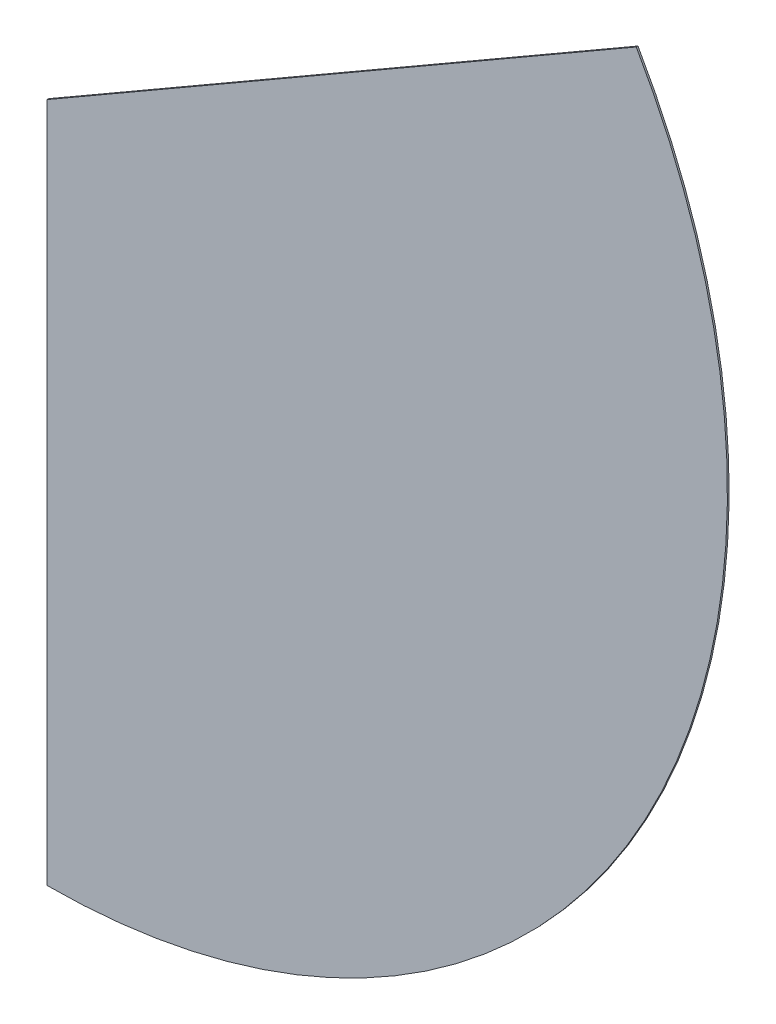
ISO-10303-21;
HEADER;
FILE_DESCRIPTION(('STEP AP214'),'2;1');
FILE_NAME('part.step','',(''),(''),'','','');
FILE_SCHEMA(('AUTOMOTIVE_DESIGN { 1 0 10303 214 1 1 1 1 }'));
ENDSEC;
DATA;
#1=APPLICATION_CONTEXT('core data for automotive mechanical design processes');
#2=APPLICATION_PROTOCOL_DEFINITION('international standard','automotive_design',2000,#1);
#3=PRODUCT_CONTEXT('',#1,'mechanical');
#4=PRODUCT('Part','Part','',(#3));
#5=PRODUCT_RELATED_PRODUCT_CATEGORY('part','',(#4));
#6=PRODUCT_DEFINITION_FORMATION('','',#4);
#7=PRODUCT_DEFINITION_CONTEXT('part definition',#1,'design');
#8=PRODUCT_DEFINITION('design','',#6,#7);
#9=PRODUCT_DEFINITION_SHAPE('','',#8);
#10=(LENGTH_UNIT() NAMED_UNIT(*) SI_UNIT(.MILLI.,.METRE.));
#11=(NAMED_UNIT(*) PLANE_ANGLE_UNIT() SI_UNIT($,.RADIAN.));
#12=(NAMED_UNIT(*) SI_UNIT($,.STERADIAN.) SOLID_ANGLE_UNIT());
#13=UNCERTAINTY_MEASURE_WITH_UNIT(LENGTH_MEASURE(1.E-05),#10,'distance_accuracy_value','');
#14=(GEOMETRIC_REPRESENTATION_CONTEXT(3) GLOBAL_UNCERTAINTY_ASSIGNED_CONTEXT((#13)) GLOBAL_UNIT_ASSIGNED_CONTEXT((#10,
#11,#12)) REPRESENTATION_CONTEXT('',''));
#15=CARTESIAN_POINT('',(0.,0.,0.));
#16=DIRECTION('',(0.,0.,1.));
#17=DIRECTION('',(1.,0.,0.));
#18=AXIS2_PLACEMENT_3D('',#15,#16,#17);
#19=CARTESIAN_POINT('',(0.,0.,0.39116));
#20=DIRECTION('',(1.,0.,0.));
#21=DIRECTION('',(0.,1.,0.));
#22=AXIS2_PLACEMENT_3D('',#19,#20,#21);
#23=PLANE('',#22);
#24=DIRECTION('',(0.,-1.,0.));
#25=VECTOR('',#24,1.);
#26=CARTESIAN_POINT('',(0.,0.,0.));
#27=LINE('',#26,#25);
#28=CARTESIAN_POINT('',(0.,0.,0.));
#29=VERTEX_POINT('',#28);
#30=CARTESIAN_POINT('',(0.,-155.,0.));
#31=VERTEX_POINT('',#30);
#32=EDGE_CURVE('E82',#29,#31,#27,.T.);
#33=ORIENTED_EDGE('',*,*,#32,.T.);
#34=DIRECTION('',(0.,0.,-1.));
#35=VECTOR('',#34,1.);
#36=CARTESIAN_POINT('',(0.,-155.,0.39116));
#37=LINE('',#36,#35);
#38=CARTESIAN_POINT('',(0.,-155.,0.39116));
#39=VERTEX_POINT('',#38);
#40=EDGE_CURVE('E11',#39,#31,#37,.T.);
#41=ORIENTED_EDGE('',*,*,#40,.F.);
#42=DIRECTION('',(0.,-1.,0.));
#43=VECTOR('',#42,1.);
#44=CARTESIAN_POINT('',(0.,0.,0.39116));
#45=LINE('',#44,#43);
#46=CARTESIAN_POINT('',(0.,0.,0.39116));
#47=VERTEX_POINT('',#46);
#48=EDGE_CURVE('E75',#47,#39,#45,.T.);
#49=ORIENTED_EDGE('',*,*,#48,.F.);
#50=DIRECTION('',(0.,0.,-1.));
#51=VECTOR('',#50,1.);
#52=CARTESIAN_POINT('',(0.,0.,0.39116));
#53=LINE('',#52,#51);
#54=EDGE_CURVE('E83',#47,#29,#53,.T.);
#55=ORIENTED_EDGE('',*,*,#54,.T.);
#56=EDGE_LOOP('',(#33,#41,#49,#55));
#57=FACE_BOUND('',#56,.T.);
#58=ADVANCED_FACE('F35',(#57),#23,.F.);
#59=CARTESIAN_POINT('',(0.,0.,0.39116));
#60=DIRECTION('',(0.,0.,-1.));
#61=DIRECTION('',(-1.,0.,0.));
#62=AXIS2_PLACEMENT_3D('',#59,#60,#61);
#63=CYLINDRICAL_SURFACE('',#62,155.);
#64=CARTESIAN_POINT('',(0.,0.,0.));
#65=DIRECTION('',(0.,0.,1.));
#66=DIRECTION('',(-1.,0.,0.));
#67=AXIS2_PLACEMENT_3D('',#64,#65,#66);
#68=CIRCLE('',#67,155.);
#69=CARTESIAN_POINT('',(134.233937586588,77.5000000000007,0.));
#70=VERTEX_POINT('',#69);
#71=EDGE_CURVE('E63',#31,#70,#68,.T.);
#72=ORIENTED_EDGE('',*,*,#71,.T.);
#73=DIRECTION('',(0.,0.,-1.));
#74=VECTOR('',#73,1.);
#75=CARTESIAN_POINT('',(134.233937586588,77.5000000000007,0.39116));
#76=LINE('',#75,#74);
#77=CARTESIAN_POINT('',(134.233937586588,77.5000000000007,0.39116));
#78=VERTEX_POINT('',#77);
#79=EDGE_CURVE('E43',#78,#70,#76,.T.);
#80=ORIENTED_EDGE('',*,*,#79,.F.);
#81=CARTESIAN_POINT('',(0.,0.,0.39116));
#82=DIRECTION('',(0.,0.,1.));
#83=DIRECTION('',(-1.,0.,0.));
#84=AXIS2_PLACEMENT_3D('',#81,#82,#83);
#85=CIRCLE('',#84,155.);
#86=EDGE_CURVE('E71',#39,#78,#85,.T.);
#87=ORIENTED_EDGE('',*,*,#86,.F.);
#88=ORIENTED_EDGE('',*,*,#40,.T.);
#89=EDGE_LOOP('',(#72,#80,#87,#88));
#90=FACE_BOUND('',#89,.T.);
#91=ADVANCED_FACE('F72',(#90),#63,.T.);
#92=CARTESIAN_POINT('',(0.,0.,0.39116));
#93=DIRECTION('',(0.500000000000004,-0.866025403784436,0.));
#94=DIRECTION('',(0.866025403784436,0.500000000000004,0.));
#95=AXIS2_PLACEMENT_3D('',#92,#93,#94);
#96=PLANE('',#95);
#97=DIRECTION('',(-0.866025403784436,-0.500000000000004,0.));
#98=VECTOR('',#97,1.);
#99=CARTESIAN_POINT('',(0.,0.,0.));
#100=LINE('',#99,#98);
#101=EDGE_CURVE('E68',#70,#29,#100,.T.);
#102=ORIENTED_EDGE('',*,*,#101,.T.);
#103=ORIENTED_EDGE('',*,*,#54,.F.);
#104=DIRECTION('',(-0.866025403784436,-0.500000000000004,0.));
#105=VECTOR('',#104,1.);
#106=CARTESIAN_POINT('',(0.,0.,0.39116));
#107=LINE('',#106,#105);
#108=EDGE_CURVE('E51',#78,#47,#107,.T.);
#109=ORIENTED_EDGE('',*,*,#108,.F.);
#110=ORIENTED_EDGE('',*,*,#79,.T.);
#111=EDGE_LOOP('',(#102,#103,#109,#110));
#112=FACE_BOUND('',#111,.T.);
#113=ADVANCED_FACE('F90',(#112),#96,.F.);
#114=CARTESIAN_POINT('',(0.,0.,0.39116));
#115=DIRECTION('',(0.,0.,-1.));
#116=DIRECTION('',(-1.,0.,0.));
#117=AXIS2_PLACEMENT_3D('',#114,#115,#116);
#118=PLANE('',#117);
#119=ORIENTED_EDGE('',*,*,#48,.T.);
#120=ORIENTED_EDGE('',*,*,#86,.T.);
#121=ORIENTED_EDGE('',*,*,#108,.T.);
#122=EDGE_LOOP('',(#119,#120,#121));
#123=FACE_BOUND('',#122,.T.);
#124=ADVANCED_FACE('F78',(#123),#118,.F.);
#125=CARTESIAN_POINT('',(0.,0.,0.));
#126=DIRECTION('',(0.,0.,-1.));
#127=DIRECTION('',(-1.,0.,0.));
#128=AXIS2_PLACEMENT_3D('',#125,#126,#127);
#129=PLANE('',#128);
#130=ORIENTED_EDGE('',*,*,#32,.F.);
#131=ORIENTED_EDGE('',*,*,#101,.F.);
#132=ORIENTED_EDGE('',*,*,#71,.F.);
#133=EDGE_LOOP('',(#130,#131,#132));
#134=FACE_BOUND('',#133,.T.);
#135=ADVANCED_FACE('F91',(#134),#129,.T.);
#136=CLOSED_SHELL('',(#58,#91,#113,#124,#135));
#137=MANIFOLD_SOLID_BREP('B2',#136);
#138=ADVANCED_BREP_SHAPE_REPRESENTATION('',(#18,#137),#14);
#139=SHAPE_DEFINITION_REPRESENTATION(#9,#138);
ENDSEC;
END-ISO-10303-21;
